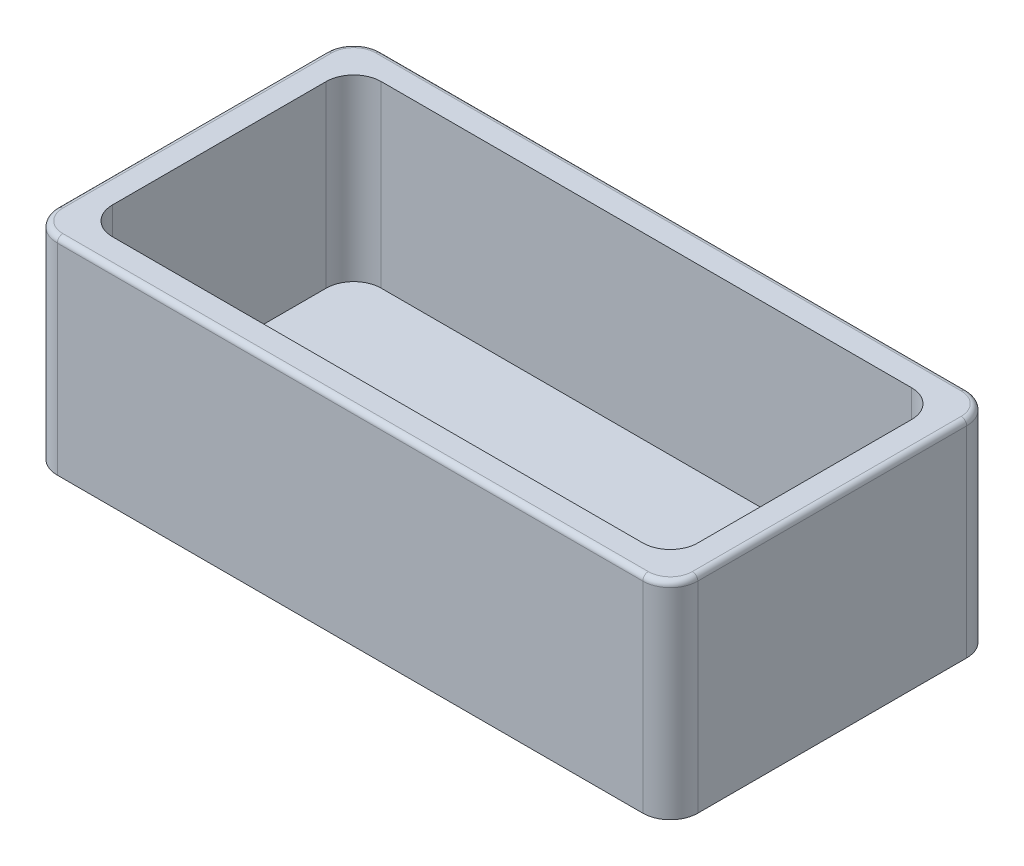
ISO-10303-21;
HEADER;
FILE_DESCRIPTION(('STEP AP214'),'2;1');
FILE_NAME('part.step','',(''),(''),'','','');
FILE_SCHEMA(('AUTOMOTIVE_DESIGN { 1 0 10303 214 1 1 1 1 }'));
ENDSEC;
DATA;
#1=APPLICATION_CONTEXT('core data for automotive mechanical design processes');
#2=APPLICATION_PROTOCOL_DEFINITION('international standard','automotive_design',2000,#1);
#3=PRODUCT_CONTEXT('',#1,'mechanical');
#4=PRODUCT('Part','Part','',(#3));
#5=PRODUCT_RELATED_PRODUCT_CATEGORY('part','',(#4));
#6=PRODUCT_DEFINITION_FORMATION('','',#4);
#7=PRODUCT_DEFINITION_CONTEXT('part definition',#1,'design');
#8=PRODUCT_DEFINITION('design','',#6,#7);
#9=PRODUCT_DEFINITION_SHAPE('','',#8);
#10=(LENGTH_UNIT() NAMED_UNIT(*) SI_UNIT(.MILLI.,.METRE.));
#11=(NAMED_UNIT(*) PLANE_ANGLE_UNIT() SI_UNIT($,.RADIAN.));
#12=(NAMED_UNIT(*) SI_UNIT($,.STERADIAN.) SOLID_ANGLE_UNIT());
#13=UNCERTAINTY_MEASURE_WITH_UNIT(LENGTH_MEASURE(1.E-05),#10,'distance_accuracy_value','');
#14=(GEOMETRIC_REPRESENTATION_CONTEXT(3) GLOBAL_UNCERTAINTY_ASSIGNED_CONTEXT((#13)) GLOBAL_UNIT_ASSIGNED_CONTEXT((#10,
#11,#12)) REPRESENTATION_CONTEXT('',''));
#15=CARTESIAN_POINT('',(0.,0.,0.));
#16=DIRECTION('',(0.,0.,1.));
#17=DIRECTION('',(1.,0.,0.));
#18=AXIS2_PLACEMENT_3D('',#15,#16,#17);
#19=CARTESIAN_POINT('',(0.,75.,0.));
#20=DIRECTION('',(0.,1.,0.));
#21=DIRECTION('',(0.,0.,1.));
#22=AXIS2_PLACEMENT_3D('',#19,#20,#21);
#23=PLANE('',#22);
#24=DIRECTION('',(0.,0.,1.));
#25=VECTOR('',#24,1.);
#26=CARTESIAN_POINT('',(-106.600634240789,75.,-55.8103102764005));
#27=LINE('',#26,#25);
#28=CARTESIAN_POINT('',(-106.600634240789,75.,-35.8103102764005));
#29=VERTEX_POINT('',#28);
#30=CARTESIAN_POINT('',(-106.600634240789,75.,41.8132162322969));
#31=VERTEX_POINT('',#30);
#32=EDGE_CURVE('E412',#29,#31,#27,.T.);
#33=ORIENTED_EDGE('',*,*,#32,.F.);
#34=CARTESIAN_POINT('',(-96.6006342407889,75.,-35.8103102764005));
#35=DIRECTION('',(0.,1.,0.));
#36=DIRECTION('',(0.,0.,1.));
#37=AXIS2_PLACEMENT_3D('',#34,#35,#36);
#38=CIRCLE('',#37,10.);
#39=CARTESIAN_POINT('',(-96.6006342407889,75.,-45.8103102764005));
#40=VERTEX_POINT('',#39);
#41=EDGE_CURVE('E253',#29,#40,#38,.F.);
#42=ORIENTED_EDGE('',*,*,#41,.T.);
#43=DIRECTION('',(-1.,0.,0.));
#44=VECTOR('',#43,1.);
#45=CARTESIAN_POINT('',(-116.600634240789,75.,-45.8103102764005));
#46=LINE('',#45,#44);
#47=CARTESIAN_POINT('',(96.0074293998082,75.,-45.8103102764005));
#48=VERTEX_POINT('',#47);
#49=EDGE_CURVE('E401',#48,#40,#46,.T.);
#50=ORIENTED_EDGE('',*,*,#49,.F.);
#51=CARTESIAN_POINT('',(96.0074293998082,75.,-35.8103102764005));
#52=DIRECTION('',(0.,1.,0.));
#53=DIRECTION('',(0.,0.,1.));
#54=AXIS2_PLACEMENT_3D('',#51,#52,#53);
#55=CIRCLE('',#54,10.);
#56=CARTESIAN_POINT('',(106.007429399808,75.,-35.8103102764005));
#57=VERTEX_POINT('',#56);
#58=EDGE_CURVE('E248',#48,#57,#55,.F.);
#59=ORIENTED_EDGE('',*,*,#58,.T.);
#60=DIRECTION('',(0.,0.,-1.));
#61=VECTOR('',#60,1.);
#62=CARTESIAN_POINT('',(106.007429399808,75.,-55.8103102764005));
#63=LINE('',#62,#61);
#64=CARTESIAN_POINT('',(106.007429399808,75.,41.8132162322969));
#65=VERTEX_POINT('',#64);
#66=EDGE_CURVE('E405',#65,#57,#63,.T.);
#67=ORIENTED_EDGE('',*,*,#66,.F.);
#68=CARTESIAN_POINT('',(96.0074293998083,75.,41.8132162322969));
#69=DIRECTION('',(0.,1.,0.));
#70=DIRECTION('',(0.,0.,1.));
#71=AXIS2_PLACEMENT_3D('',#68,#69,#70);
#72=CIRCLE('',#71,10.);
#73=CARTESIAN_POINT('',(96.0074293998083,75.,51.8132162322969));
#74=VERTEX_POINT('',#73);
#75=EDGE_CURVE('E209',#65,#74,#72,.F.);
#76=ORIENTED_EDGE('',*,*,#75,.T.);
#77=DIRECTION('',(1.,0.,0.));
#78=VECTOR('',#77,1.);
#79=CARTESIAN_POINT('',(-116.600634240789,75.,51.8132162322969));
#80=LINE('',#79,#78);
#81=CARTESIAN_POINT('',(-96.6006342407889,75.,51.8132162322969));
#82=VERTEX_POINT('',#81);
#83=EDGE_CURVE('E408',#82,#74,#80,.T.);
#84=ORIENTED_EDGE('',*,*,#83,.F.);
#85=CARTESIAN_POINT('',(-96.6006342407889,75.,41.8132162322969));
#86=DIRECTION('',(0.,1.,0.));
#87=DIRECTION('',(0.,0.,1.));
#88=AXIS2_PLACEMENT_3D('',#85,#86,#87);
#89=CIRCLE('',#88,10.);
#90=EDGE_CURVE('E256',#82,#31,#89,.F.);
#91=ORIENTED_EDGE('',*,*,#90,.T.);
#92=EDGE_LOOP('',(#33,#42,#50,#59,#67,#76,#84,#91));
#93=FACE_BOUND('',#92,.T.);
#94=CARTESIAN_POINT('',(106.007429399808,75.,-45.8103102764005));
#95=DIRECTION('',(0.,1.,0.));
#96=DIRECTION('',(0.,0.,1.));
#97=AXIS2_PLACEMENT_3D('',#94,#95,#96);
#98=CIRCLE('',#97,8.);
#99=CARTESIAN_POINT('',(106.007429399808,75.,-53.8103102764005));
#100=VERTEX_POINT('',#99);
#101=CARTESIAN_POINT('',(114.007429399808,75.,-45.8103102764005));
#102=VERTEX_POINT('',#101);
#103=EDGE_CURVE('E308',#100,#102,#98,.F.);
#104=ORIENTED_EDGE('',*,*,#103,.F.);
#105=DIRECTION('',(-1.,0.,0.));
#106=VECTOR('',#105,1.);
#107=CARTESIAN_POINT('',(-116.600634240789,75.,-53.8103102764005));
#108=LINE('',#107,#106);
#109=CARTESIAN_POINT('',(-106.600634240789,75.,-53.8103102764005));
#110=VERTEX_POINT('',#109);
#111=EDGE_CURVE('E271',#100,#110,#108,.T.);
#112=ORIENTED_EDGE('',*,*,#111,.T.);
#113=CARTESIAN_POINT('',(-106.600634240789,75.,-45.8103102764005));
#114=DIRECTION('',(0.,1.,0.));
#115=DIRECTION('',(0.,0.,1.));
#116=AXIS2_PLACEMENT_3D('',#113,#114,#115);
#117=CIRCLE('',#116,8.);
#118=CARTESIAN_POINT('',(-114.600634240789,75.,-45.8103102764005));
#119=VERTEX_POINT('',#118);
#120=EDGE_CURVE('E304',#119,#110,#117,.F.);
#121=ORIENTED_EDGE('',*,*,#120,.F.);
#122=DIRECTION('',(0.,0.,1.));
#123=VECTOR('',#122,1.);
#124=CARTESIAN_POINT('',(-114.600634240789,75.,61.8132162322969));
#125=LINE('',#124,#123);
#126=CARTESIAN_POINT('',(-114.600634240789,75.,51.8132162322969));
#127=VERTEX_POINT('',#126);
#128=EDGE_CURVE('E267',#119,#127,#125,.T.);
#129=ORIENTED_EDGE('',*,*,#128,.T.);
#130=CARTESIAN_POINT('',(-106.600634240789,75.,51.8132162322969));
#131=DIRECTION('',(0.,1.,0.));
#132=DIRECTION('',(0.,0.,1.));
#133=AXIS2_PLACEMENT_3D('',#130,#131,#132);
#134=CIRCLE('',#133,8.);
#135=CARTESIAN_POINT('',(-106.600634240789,75.,59.8132162322969));
#136=VERTEX_POINT('',#135);
#137=EDGE_CURVE('E300',#136,#127,#134,.F.);
#138=ORIENTED_EDGE('',*,*,#137,.F.);
#139=DIRECTION('',(1.,0.,0.));
#140=VECTOR('',#139,1.);
#141=CARTESIAN_POINT('',(116.007429399808,75.,59.8132162322969));
#142=LINE('',#141,#140);
#143=CARTESIAN_POINT('',(106.007429399808,75.,59.8132162322969));
#144=VERTEX_POINT('',#143);
#145=EDGE_CURVE('E263',#136,#144,#142,.T.);
#146=ORIENTED_EDGE('',*,*,#145,.T.);
#147=CARTESIAN_POINT('',(106.007429399808,75.,51.8132162322969));
#148=DIRECTION('',(0.,1.,0.));
#149=DIRECTION('',(0.,0.,1.));
#150=AXIS2_PLACEMENT_3D('',#147,#148,#149);
#151=CIRCLE('',#150,8.);
#152=CARTESIAN_POINT('',(114.007429399808,75.,51.8132162322969));
#153=VERTEX_POINT('',#152);
#154=EDGE_CURVE('E297',#153,#144,#151,.F.);
#155=ORIENTED_EDGE('',*,*,#154,.F.);
#156=DIRECTION('',(0.,0.,-1.));
#157=VECTOR('',#156,1.);
#158=CARTESIAN_POINT('',(114.007429399808,75.,-55.8103102764005));
#159=LINE('',#158,#157);
#160=EDGE_CURVE('E259',#153,#102,#159,.T.);
#161=ORIENTED_EDGE('',*,*,#160,.T.);
#162=EDGE_LOOP('',(#104,#112,#121,#129,#138,#146,#155,#161));
#163=FACE_BOUND('',#162,.T.);
#164=ADVANCED_FACE('F41',(#93,#163),#23,.T.);
#165=CARTESIAN_POINT('',(-116.600634240789,75.,-55.8103102764005));
#166=DIRECTION('',(1.,0.,0.));
#167=DIRECTION('',(0.,0.,-1.));
#168=AXIS2_PLACEMENT_3D('',#165,#166,#167);
#169=PLANE('',#168);
#170=DIRECTION('',(0.,0.,1.));
#171=VECTOR('',#170,1.);
#172=CARTESIAN_POINT('',(-116.600634240789,0.,-55.8103102764005));
#173=LINE('',#172,#171);
#174=CARTESIAN_POINT('',(-116.600634240789,0.,-45.8103102764005));
#175=VERTEX_POINT('',#174);
#176=CARTESIAN_POINT('',(-116.600634240789,0.,51.8132162322969));
#177=VERTEX_POINT('',#176);
#178=EDGE_CURVE('E395',#175,#177,#173,.T.);
#179=ORIENTED_EDGE('',*,*,#178,.T.);
#180=DIRECTION('',(0.,-1.,0.));
#181=VECTOR('',#180,1.);
#182=CARTESIAN_POINT('',(-116.600634240789,75.,51.8132162322969));
#183=LINE('',#182,#181);
#184=CARTESIAN_POINT('',(-116.600634240789,73.,51.8132162322969));
#185=VERTEX_POINT('',#184);
#186=EDGE_CURVE('E355',#177,#185,#183,.F.);
#187=ORIENTED_EDGE('',*,*,#186,.T.);
#188=DIRECTION('',(0.,0.,1.));
#189=VECTOR('',#188,1.);
#190=CARTESIAN_POINT('',(-116.600634240789,73.,-55.8103102764005));
#191=LINE('',#190,#189);
#192=CARTESIAN_POINT('',(-116.600634240789,73.,-45.8103102764005));
#193=VERTEX_POINT('',#192);
#194=EDGE_CURVE('E279',#185,#193,#191,.F.);
#195=ORIENTED_EDGE('',*,*,#194,.T.);
#196=DIRECTION('',(0.,-1.,0.));
#197=VECTOR('',#196,1.);
#198=CARTESIAN_POINT('',(-116.600634240789,75.,-45.8103102764005));
#199=LINE('',#198,#197);
#200=EDGE_CURVE('E352',#193,#175,#199,.T.);
#201=ORIENTED_EDGE('',*,*,#200,.T.);
#202=EDGE_LOOP('',(#179,#187,#195,#201));
#203=FACE_BOUND('',#202,.T.);
#204=ADVANCED_FACE('F463',(#203),#169,.F.);
#205=CARTESIAN_POINT('',(-116.600634240789,75.,61.8132162322969));
#206=DIRECTION('',(0.,0.,-1.));
#207=DIRECTION('',(-1.,0.,0.));
#208=AXIS2_PLACEMENT_3D('',#205,#206,#207);
#209=PLANE('',#208);
#210=DIRECTION('',(1.,0.,0.));
#211=VECTOR('',#210,1.);
#212=CARTESIAN_POINT('',(-116.600634240789,0.,61.8132162322969));
#213=LINE('',#212,#211);
#214=CARTESIAN_POINT('',(-106.600634240789,0.,61.8132162322969));
#215=VERTEX_POINT('',#214);
#216=CARTESIAN_POINT('',(106.007429399808,0.,61.8132162322969));
#217=VERTEX_POINT('',#216);
#218=EDGE_CURVE('E393',#215,#217,#213,.T.);
#219=ORIENTED_EDGE('',*,*,#218,.T.);
#220=DIRECTION('',(0.,-1.,0.));
#221=VECTOR('',#220,1.);
#222=CARTESIAN_POINT('',(106.007429399808,75.,61.8132162322969));
#223=LINE('',#222,#221);
#224=CARTESIAN_POINT('',(106.007429399808,73.,61.8132162322969));
#225=VERTEX_POINT('',#224);
#226=EDGE_CURVE('E349',#217,#225,#223,.F.);
#227=ORIENTED_EDGE('',*,*,#226,.T.);
#228=DIRECTION('',(1.,0.,0.));
#229=VECTOR('',#228,1.);
#230=CARTESIAN_POINT('',(-116.600634240789,73.,61.8132162322969));
#231=LINE('',#230,#229);
#232=CARTESIAN_POINT('',(-106.600634240789,73.,61.8132162322969));
#233=VERTEX_POINT('',#232);
#234=EDGE_CURVE('E283',#225,#233,#231,.F.);
#235=ORIENTED_EDGE('',*,*,#234,.T.);
#236=DIRECTION('',(0.,-1.,0.));
#237=VECTOR('',#236,1.);
#238=CARTESIAN_POINT('',(-106.600634240789,75.,61.8132162322969));
#239=LINE('',#238,#237);
#240=EDGE_CURVE('E66',#233,#215,#239,.T.);
#241=ORIENTED_EDGE('',*,*,#240,.T.);
#242=EDGE_LOOP('',(#219,#227,#235,#241));
#243=FACE_BOUND('',#242,.T.);
#244=ADVANCED_FACE('F468',(#243),#209,.F.);
#245=CARTESIAN_POINT('',(116.007429399808,75.,-55.8103102764005));
#246=DIRECTION('',(-1.,0.,0.));
#247=DIRECTION('',(0.,0.,1.));
#248=AXIS2_PLACEMENT_3D('',#245,#246,#247);
#249=PLANE('',#248);
#250=DIRECTION('',(0.,0.,-1.));
#251=VECTOR('',#250,1.);
#252=CARTESIAN_POINT('',(116.007429399808,73.,61.8132162322969));
#253=LINE('',#252,#251);
#254=CARTESIAN_POINT('',(116.007429399808,73.,-45.8103102764005));
#255=VERTEX_POINT('',#254);
#256=CARTESIAN_POINT('',(116.007429399808,73.,51.8132162322969));
#257=VERTEX_POINT('',#256);
#258=EDGE_CURVE('E286',#255,#257,#253,.F.);
#259=ORIENTED_EDGE('',*,*,#258,.T.);
#260=DIRECTION('',(0.,-1.,0.));
#261=VECTOR('',#260,1.);
#262=CARTESIAN_POINT('',(116.007429399808,75.,51.8132162322969));
#263=LINE('',#262,#261);
#264=CARTESIAN_POINT('',(116.007429399808,0.,51.8132162322969));
#265=VERTEX_POINT('',#264);
#266=EDGE_CURVE('E333',#257,#265,#263,.T.);
#267=ORIENTED_EDGE('',*,*,#266,.T.);
#268=DIRECTION('',(0.,0.,-1.));
#269=VECTOR('',#268,1.);
#270=CARTESIAN_POINT('',(116.007429399808,0.,-55.8103102764005));
#271=LINE('',#270,#269);
#272=CARTESIAN_POINT('',(116.007429399808,0.,-45.8103102764005));
#273=VERTEX_POINT('',#272);
#274=EDGE_CURVE('E218',#265,#273,#271,.T.);
#275=ORIENTED_EDGE('',*,*,#274,.T.);
#276=DIRECTION('',(0.,-1.,0.));
#277=VECTOR('',#276,1.);
#278=CARTESIAN_POINT('',(116.007429399808,75.,-45.8103102764005));
#279=LINE('',#278,#277);
#280=EDGE_CURVE('E330',#273,#255,#279,.F.);
#281=ORIENTED_EDGE('',*,*,#280,.T.);
#282=EDGE_LOOP('',(#259,#267,#275,#281));
#283=FACE_BOUND('',#282,.T.);
#284=ADVANCED_FACE('F386',(#283),#249,.F.);
#285=CARTESIAN_POINT('',(-116.600634240789,75.,-55.8103102764005));
#286=DIRECTION('',(0.,0.,1.));
#287=DIRECTION('',(1.,0.,0.));
#288=AXIS2_PLACEMENT_3D('',#285,#286,#287);
#289=PLANE('',#288);
#290=DIRECTION('',(-1.,0.,0.));
#291=VECTOR('',#290,1.);
#292=CARTESIAN_POINT('',(-116.600634240789,0.,-55.8103102764005));
#293=LINE('',#292,#291);
#294=CARTESIAN_POINT('',(106.007429399808,0.,-55.8103102764005));
#295=VERTEX_POINT('',#294);
#296=CARTESIAN_POINT('',(-106.600634240789,0.,-55.8103102764005));
#297=VERTEX_POINT('',#296);
#298=EDGE_CURVE('E211',#295,#297,#293,.T.);
#299=ORIENTED_EDGE('',*,*,#298,.T.);
#300=DIRECTION('',(0.,-1.,0.));
#301=VECTOR('',#300,1.);
#302=CARTESIAN_POINT('',(-106.600634240789,75.,-55.8103102764005));
#303=LINE('',#302,#301);
#304=CARTESIAN_POINT('',(-106.600634240789,73.,-55.8103102764005));
#305=VERTEX_POINT('',#304);
#306=EDGE_CURVE('E11',#297,#305,#303,.F.);
#307=ORIENTED_EDGE('',*,*,#306,.T.);
#308=DIRECTION('',(-1.,0.,0.));
#309=VECTOR('',#308,1.);
#310=CARTESIAN_POINT('',(116.007429399808,73.,-55.8103102764005));
#311=LINE('',#310,#309);
#312=CARTESIAN_POINT('',(106.007429399808,73.,-55.8103102764005));
#313=VERTEX_POINT('',#312);
#314=EDGE_CURVE('E275',#305,#313,#311,.F.);
#315=ORIENTED_EDGE('',*,*,#314,.T.);
#316=DIRECTION('',(0.,-1.,0.));
#317=VECTOR('',#316,1.);
#318=CARTESIAN_POINT('',(106.007429399808,75.,-55.8103102764005));
#319=LINE('',#318,#317);
#320=EDGE_CURVE('E51',#313,#295,#319,.T.);
#321=ORIENTED_EDGE('',*,*,#320,.T.);
#322=EDGE_LOOP('',(#299,#307,#315,#321));
#323=FACE_BOUND('',#322,.T.);
#324=ADVANCED_FACE('F476',(#323),#289,.F.);
#325=CARTESIAN_POINT('',(0.,0.,0.));
#326=DIRECTION('',(0.,1.,0.));
#327=DIRECTION('',(0.,0.,1.));
#328=AXIS2_PLACEMENT_3D('',#325,#326,#327);
#329=PLANE('',#328);
#330=ORIENTED_EDGE('',*,*,#274,.F.);
#331=CARTESIAN_POINT('',(106.007429399808,0.,51.8132162322969));
#332=DIRECTION('',(0.,1.,0.));
#333=DIRECTION('',(0.,0.,1.));
#334=AXIS2_PLACEMENT_3D('',#331,#332,#333);
#335=CIRCLE('',#334,10.);
#336=EDGE_CURVE('E59',#265,#217,#335,.F.);
#337=ORIENTED_EDGE('',*,*,#336,.T.);
#338=ORIENTED_EDGE('',*,*,#218,.F.);
#339=CARTESIAN_POINT('',(-106.600634240789,0.,51.8132162322969));
#340=DIRECTION('',(0.,1.,0.));
#341=DIRECTION('',(0.,0.,1.));
#342=AXIS2_PLACEMENT_3D('',#339,#340,#341);
#343=CIRCLE('',#342,10.);
#344=EDGE_CURVE('E342',#215,#177,#343,.F.);
#345=ORIENTED_EDGE('',*,*,#344,.T.);
#346=ORIENTED_EDGE('',*,*,#178,.F.);
#347=CARTESIAN_POINT('',(-106.600634240789,0.,-45.8103102764005));
#348=DIRECTION('',(0.,1.,0.));
#349=DIRECTION('',(0.,0.,1.));
#350=AXIS2_PLACEMENT_3D('',#347,#348,#349);
#351=CIRCLE('',#350,10.);
#352=EDGE_CURVE('E339',#175,#297,#351,.F.);
#353=ORIENTED_EDGE('',*,*,#352,.T.);
#354=ORIENTED_EDGE('',*,*,#298,.F.);
#355=CARTESIAN_POINT('',(106.007429399808,0.,-45.8103102764005));
#356=DIRECTION('',(0.,1.,0.));
#357=DIRECTION('',(0.,0.,1.));
#358=AXIS2_PLACEMENT_3D('',#355,#356,#357);
#359=CIRCLE('',#358,10.);
#360=EDGE_CURVE('E336',#295,#273,#359,.F.);
#361=ORIENTED_EDGE('',*,*,#360,.T.);
#362=EDGE_LOOP('',(#330,#337,#338,#345,#346,#353,#354,#361));
#363=FACE_BOUND('',#362,.T.);
#364=ADVANCED_FACE('F389',(#363),#329,.F.);
#365=CARTESIAN_POINT('',(-106.600634240789,75.,-55.8103102764005));
#366=DIRECTION('',(1.,0.,0.));
#367=DIRECTION('',(0.,0.,-1.));
#368=AXIS2_PLACEMENT_3D('',#365,#366,#367);
#369=PLANE('',#368);
#370=DIRECTION('',(0.,0.,1.));
#371=VECTOR('',#370,1.);
#372=CARTESIAN_POINT('',(-106.600634240789,9.99999999999999,-55.8103102764005));
#373=LINE('',#372,#371);
#374=CARTESIAN_POINT('',(-106.600634240789,9.99999999999999,-35.8103102764005));
#375=VERTEX_POINT('',#374);
#376=CARTESIAN_POINT('',(-106.600634240789,9.99999999999999,41.8132162322969));
#377=VERTEX_POINT('',#376);
#378=EDGE_CURVE('E364',#375,#377,#373,.T.);
#379=ORIENTED_EDGE('',*,*,#378,.F.);
#380=DIRECTION('',(0.,-1.,0.));
#381=VECTOR('',#380,1.);
#382=CARTESIAN_POINT('',(-106.600634240789,75.,-35.8103102764005));
#383=LINE('',#382,#381);
#384=EDGE_CURVE('E245',#375,#29,#383,.F.);
#385=ORIENTED_EDGE('',*,*,#384,.T.);
#386=ORIENTED_EDGE('',*,*,#32,.T.);
#387=DIRECTION('',(0.,-1.,0.));
#388=VECTOR('',#387,1.);
#389=CARTESIAN_POINT('',(-106.600634240789,9.99999999999999,41.8132162322969));
#390=LINE('',#389,#388);
#391=EDGE_CURVE('E241',#31,#377,#390,.T.);
#392=ORIENTED_EDGE('',*,*,#391,.T.);
#393=EDGE_LOOP('',(#379,#385,#386,#392));
#394=FACE_BOUND('',#393,.T.);
#395=ADVANCED_FACE('F426',(#394),#369,.T.);
#396=CARTESIAN_POINT('',(-116.600634240789,75.,51.8132162322969));
#397=DIRECTION('',(0.,0.,-1.));
#398=DIRECTION('',(-1.,0.,0.));
#399=AXIS2_PLACEMENT_3D('',#396,#397,#398);
#400=PLANE('',#399);
#401=ORIENTED_EDGE('',*,*,#83,.T.);
#402=DIRECTION('',(0.,-1.,0.));
#403=VECTOR('',#402,1.);
#404=CARTESIAN_POINT('',(96.0074293998083,9.99999999999999,51.8132162322969));
#405=LINE('',#404,#403);
#406=CARTESIAN_POINT('',(96.0074293998083,9.99999999999999,51.8132162322969));
#407=VERTEX_POINT('',#406);
#408=EDGE_CURVE('E238',#74,#407,#405,.T.);
#409=ORIENTED_EDGE('',*,*,#408,.T.);
#410=DIRECTION('',(1.,0.,0.));
#411=VECTOR('',#410,1.);
#412=CARTESIAN_POINT('',(-116.600634240789,9.99999999999999,51.8132162322969));
#413=LINE('',#412,#411);
#414=CARTESIAN_POINT('',(-96.6006342407889,9.99999999999999,51.8132162322969));
#415=VERTEX_POINT('',#414);
#416=EDGE_CURVE('E187',#415,#407,#413,.T.);
#417=ORIENTED_EDGE('',*,*,#416,.F.);
#418=DIRECTION('',(0.,-1.,0.));
#419=VECTOR('',#418,1.);
#420=CARTESIAN_POINT('',(-96.6006342407889,75.,51.8132162322969));
#421=LINE('',#420,#419);
#422=EDGE_CURVE('E235',#415,#82,#421,.F.);
#423=ORIENTED_EDGE('',*,*,#422,.T.);
#424=EDGE_LOOP('',(#401,#409,#417,#423));
#425=FACE_BOUND('',#424,.T.);
#426=ADVANCED_FACE('F446',(#425),#400,.T.);
#427=CARTESIAN_POINT('',(106.007429399808,75.,-55.8103102764005));
#428=DIRECTION('',(-1.,0.,0.));
#429=DIRECTION('',(0.,0.,1.));
#430=AXIS2_PLACEMENT_3D('',#427,#428,#429);
#431=PLANE('',#430);
#432=ORIENTED_EDGE('',*,*,#66,.T.);
#433=DIRECTION('',(0.,-1.,0.));
#434=VECTOR('',#433,1.);
#435=CARTESIAN_POINT('',(106.007429399808,9.99999999999999,-35.8103102764005));
#436=LINE('',#435,#434);
#437=CARTESIAN_POINT('',(106.007429399808,9.99999999999999,-35.8103102764005));
#438=VERTEX_POINT('',#437);
#439=EDGE_CURVE('E203',#57,#438,#436,.T.);
#440=ORIENTED_EDGE('',*,*,#439,.T.);
#441=DIRECTION('',(0.,0.,-1.));
#442=VECTOR('',#441,1.);
#443=CARTESIAN_POINT('',(106.007429399808,9.99999999999999,-55.8103102764005));
#444=LINE('',#443,#442);
#445=CARTESIAN_POINT('',(106.007429399808,9.99999999999999,41.8132162322969));
#446=VERTEX_POINT('',#445);
#447=EDGE_CURVE('E185',#446,#438,#444,.T.);
#448=ORIENTED_EDGE('',*,*,#447,.F.);
#449=DIRECTION('',(0.,-1.,0.));
#450=VECTOR('',#449,1.);
#451=CARTESIAN_POINT('',(106.007429399808,75.,41.8132162322969));
#452=LINE('',#451,#450);
#453=EDGE_CURVE('E200',#446,#65,#452,.F.);
#454=ORIENTED_EDGE('',*,*,#453,.T.);
#455=EDGE_LOOP('',(#432,#440,#448,#454));
#456=FACE_BOUND('',#455,.T.);
#457=ADVANCED_FACE('F199',(#456),#431,.T.);
#458=CARTESIAN_POINT('',(-116.600634240789,75.,-45.8103102764005));
#459=DIRECTION('',(0.,0.,1.));
#460=DIRECTION('',(1.,0.,0.));
#461=AXIS2_PLACEMENT_3D('',#458,#459,#460);
#462=PLANE('',#461);
#463=DIRECTION('',(-1.,0.,0.));
#464=VECTOR('',#463,1.);
#465=CARTESIAN_POINT('',(-116.600634240789,9.99999999999999,-45.8103102764005));
#466=LINE('',#465,#464);
#467=CARTESIAN_POINT('',(96.0074293998082,9.99999999999999,-45.8103102764005));
#468=VERTEX_POINT('',#467);
#469=CARTESIAN_POINT('',(-96.6006342407889,9.99999999999999,-45.8103102764005));
#470=VERTEX_POINT('',#469);
#471=EDGE_CURVE('E205',#468,#470,#466,.T.);
#472=ORIENTED_EDGE('',*,*,#471,.F.);
#473=DIRECTION('',(0.,-1.,0.));
#474=VECTOR('',#473,1.);
#475=CARTESIAN_POINT('',(96.0074293998082,75.,-45.8103102764005));
#476=LINE('',#475,#474);
#477=EDGE_CURVE('E232',#468,#48,#476,.F.);
#478=ORIENTED_EDGE('',*,*,#477,.T.);
#479=ORIENTED_EDGE('',*,*,#49,.T.);
#480=DIRECTION('',(0.,-1.,0.));
#481=VECTOR('',#480,1.);
#482=CARTESIAN_POINT('',(-96.6006342407889,9.99999999999999,-45.8103102764005));
#483=LINE('',#482,#481);
#484=EDGE_CURVE('E228',#40,#470,#483,.T.);
#485=ORIENTED_EDGE('',*,*,#484,.T.);
#486=EDGE_LOOP('',(#472,#478,#479,#485));
#487=FACE_BOUND('',#486,.T.);
#488=ADVANCED_FACE('F439',(#487),#462,.T.);
#489=CARTESIAN_POINT('',(0.,10.,0.));
#490=DIRECTION('',(0.,1.,0.));
#491=DIRECTION('',(0.,0.,1.));
#492=AXIS2_PLACEMENT_3D('',#489,#490,#491);
#493=PLANE('',#492);
#494=ORIENTED_EDGE('',*,*,#447,.T.);
#495=CARTESIAN_POINT('',(96.0074293998082,9.99999999999999,-35.8103102764005));
#496=DIRECTION('',(0.,1.,0.));
#497=DIRECTION('',(0.,0.,1.));
#498=AXIS2_PLACEMENT_3D('',#495,#496,#497);
#499=CIRCLE('',#498,10.);
#500=EDGE_CURVE('E193',#438,#468,#499,.T.);
#501=ORIENTED_EDGE('',*,*,#500,.T.);
#502=ORIENTED_EDGE('',*,*,#471,.T.);
#503=CARTESIAN_POINT('',(-96.6006342407889,9.99999999999999,-35.8103102764005));
#504=DIRECTION('',(0.,1.,0.));
#505=DIRECTION('',(0.,0.,1.));
#506=AXIS2_PLACEMENT_3D('',#503,#504,#505);
#507=CIRCLE('',#506,10.);
#508=EDGE_CURVE('E194',#470,#375,#507,.T.);
#509=ORIENTED_EDGE('',*,*,#508,.T.);
#510=ORIENTED_EDGE('',*,*,#378,.T.);
#511=CARTESIAN_POINT('',(-96.6006342407889,9.99999999999999,41.8132162322969));
#512=DIRECTION('',(0.,1.,0.));
#513=DIRECTION('',(0.,0.,1.));
#514=AXIS2_PLACEMENT_3D('',#511,#512,#513);
#515=CIRCLE('',#514,10.);
#516=EDGE_CURVE('E215',#377,#415,#515,.T.);
#517=ORIENTED_EDGE('',*,*,#516,.T.);
#518=ORIENTED_EDGE('',*,*,#416,.T.);
#519=CARTESIAN_POINT('',(96.0074293998083,9.99999999999999,41.8132162322969));
#520=DIRECTION('',(0.,1.,0.));
#521=DIRECTION('',(0.,0.,1.));
#522=AXIS2_PLACEMENT_3D('',#519,#520,#521);
#523=CIRCLE('',#522,10.);
#524=EDGE_CURVE('E182',#407,#446,#523,.T.);
#525=ORIENTED_EDGE('',*,*,#524,.T.);
#526=EDGE_LOOP('',(#494,#501,#502,#509,#510,#517,#518,#525));
#527=FACE_BOUND('',#526,.T.);
#528=ADVANCED_FACE('F184',(#527),#493,.T.);
#529=CARTESIAN_POINT('',(96.0074293998082,75.,-35.8103102764005));
#530=DIRECTION('',(0.,1.,0.));
#531=DIRECTION('',(0.,0.,1.));
#532=AXIS2_PLACEMENT_3D('',#529,#530,#531);
#533=CYLINDRICAL_SURFACE('',#532,10.);
#534=ORIENTED_EDGE('',*,*,#58,.F.);
#535=ORIENTED_EDGE('',*,*,#477,.F.);
#536=ORIENTED_EDGE('',*,*,#500,.F.);
#537=ORIENTED_EDGE('',*,*,#439,.F.);
#538=EDGE_LOOP('',(#534,#535,#536,#537));
#539=FACE_BOUND('',#538,.T.);
#540=ADVANCED_FACE('F442',(#539),#533,.F.);
#541=CARTESIAN_POINT('',(96.0074293998083,75.,41.8132162322969));
#542=DIRECTION('',(0.,1.,0.));
#543=DIRECTION('',(0.,0.,1.));
#544=AXIS2_PLACEMENT_3D('',#541,#542,#543);
#545=CYLINDRICAL_SURFACE('',#544,10.);
#546=ORIENTED_EDGE('',*,*,#75,.F.);
#547=ORIENTED_EDGE('',*,*,#453,.F.);
#548=ORIENTED_EDGE('',*,*,#524,.F.);
#549=ORIENTED_EDGE('',*,*,#408,.F.);
#550=EDGE_LOOP('',(#546,#547,#548,#549));
#551=FACE_BOUND('',#550,.T.);
#552=ADVANCED_FACE('F208',(#551),#545,.F.);
#553=CARTESIAN_POINT('',(-96.6006342407889,75.,-35.8103102764005));
#554=DIRECTION('',(0.,1.,0.));
#555=DIRECTION('',(0.,0.,1.));
#556=AXIS2_PLACEMENT_3D('',#553,#554,#555);
#557=CYLINDRICAL_SURFACE('',#556,10.);
#558=ORIENTED_EDGE('',*,*,#41,.F.);
#559=ORIENTED_EDGE('',*,*,#384,.F.);
#560=ORIENTED_EDGE('',*,*,#508,.F.);
#561=ORIENTED_EDGE('',*,*,#484,.F.);
#562=EDGE_LOOP('',(#558,#559,#560,#561));
#563=FACE_BOUND('',#562,.T.);
#564=ADVANCED_FACE('F431',(#563),#557,.F.);
#565=CARTESIAN_POINT('',(-96.6006342407889,75.,41.8132162322969));
#566=DIRECTION('',(0.,1.,0.));
#567=DIRECTION('',(0.,0.,1.));
#568=AXIS2_PLACEMENT_3D('',#565,#566,#567);
#569=CYLINDRICAL_SURFACE('',#568,10.);
#570=ORIENTED_EDGE('',*,*,#90,.F.);
#571=ORIENTED_EDGE('',*,*,#422,.F.);
#572=ORIENTED_EDGE('',*,*,#516,.F.);
#573=ORIENTED_EDGE('',*,*,#391,.F.);
#574=EDGE_LOOP('',(#570,#571,#572,#573));
#575=FACE_BOUND('',#574,.T.);
#576=ADVANCED_FACE('F449',(#575),#569,.F.);
#577=CARTESIAN_POINT('',(0.,73.,59.8132162322969));
#578=DIRECTION('',(-1.,0.,0.));
#579=DIRECTION('',(0.,0.,1.));
#580=AXIS2_PLACEMENT_3D('',#577,#578,#579);
#581=CYLINDRICAL_SURFACE('',#580,2.);
#582=ORIENTED_EDGE('',*,*,#234,.F.);
#583=CARTESIAN_POINT('',(106.007429399808,73.,59.8132162322969));
#584=DIRECTION('',(-1.,0.,0.));
#585=DIRECTION('',(0.,0.,1.));
#586=AXIS2_PLACEMENT_3D('',#583,#584,#585);
#587=CIRCLE('',#586,2.);
#588=EDGE_CURVE('E326',#225,#144,#587,.T.);
#589=ORIENTED_EDGE('',*,*,#588,.T.);
#590=ORIENTED_EDGE('',*,*,#145,.F.);
#591=CARTESIAN_POINT('',(-106.600634240789,73.,59.8132162322969));
#592=DIRECTION('',(1.,0.,0.));
#593=DIRECTION('',(0.,0.,-1.));
#594=AXIS2_PLACEMENT_3D('',#591,#592,#593);
#595=CIRCLE('',#594,2.);
#596=EDGE_CURVE('E323',#136,#233,#595,.T.);
#597=ORIENTED_EDGE('',*,*,#596,.T.);
#598=EDGE_LOOP('',(#582,#589,#590,#597));
#599=FACE_BOUND('',#598,.T.);
#600=ADVANCED_FACE('F451',(#599),#581,.T.);
#601=CARTESIAN_POINT('',(114.007429399808,73.,0.));
#602=DIRECTION('',(0.,0.,1.));
#603=DIRECTION('',(1.,0.,0.));
#604=AXIS2_PLACEMENT_3D('',#601,#602,#603);
#605=CYLINDRICAL_SURFACE('',#604,2.);
#606=ORIENTED_EDGE('',*,*,#258,.F.);
#607=CARTESIAN_POINT('',(114.007429399808,73.,-45.8103102764005));
#608=DIRECTION('',(0.,0.,1.));
#609=DIRECTION('',(1.,0.,0.));
#610=AXIS2_PLACEMENT_3D('',#607,#608,#609);
#611=CIRCLE('',#610,2.);
#612=EDGE_CURVE('E293',#255,#102,#611,.T.);
#613=ORIENTED_EDGE('',*,*,#612,.T.);
#614=ORIENTED_EDGE('',*,*,#160,.F.);
#615=CARTESIAN_POINT('',(114.007429399808,73.,51.8132162322969));
#616=DIRECTION('',(0.,0.,-1.));
#617=DIRECTION('',(-1.,0.,0.));
#618=AXIS2_PLACEMENT_3D('',#615,#616,#617);
#619=CIRCLE('',#618,2.);
#620=EDGE_CURVE('E290',#153,#257,#619,.T.);
#621=ORIENTED_EDGE('',*,*,#620,.T.);
#622=EDGE_LOOP('',(#606,#613,#614,#621));
#623=FACE_BOUND('',#622,.T.);
#624=ADVANCED_FACE('F457',(#623),#605,.T.);
#625=CARTESIAN_POINT('',(-114.600634240789,73.,0.));
#626=DIRECTION('',(0.,0.,-1.));
#627=DIRECTION('',(-1.,0.,0.));
#628=AXIS2_PLACEMENT_3D('',#625,#626,#627);
#629=CYLINDRICAL_SURFACE('',#628,2.);
#630=ORIENTED_EDGE('',*,*,#194,.F.);
#631=CARTESIAN_POINT('',(-114.600634240789,73.,51.8132162322969));
#632=DIRECTION('',(0.,0.,-1.));
#633=DIRECTION('',(-1.,0.,0.));
#634=AXIS2_PLACEMENT_3D('',#631,#632,#633);
#635=CIRCLE('',#634,2.);
#636=EDGE_CURVE('E320',#185,#127,#635,.T.);
#637=ORIENTED_EDGE('',*,*,#636,.T.);
#638=ORIENTED_EDGE('',*,*,#128,.F.);
#639=CARTESIAN_POINT('',(-114.600634240789,73.,-45.8103102764005));
#640=DIRECTION('',(0.,0.,1.));
#641=DIRECTION('',(1.,0.,0.));
#642=AXIS2_PLACEMENT_3D('',#639,#640,#641);
#643=CIRCLE('',#642,2.);
#644=EDGE_CURVE('E317',#119,#193,#643,.T.);
#645=ORIENTED_EDGE('',*,*,#644,.T.);
#646=EDGE_LOOP('',(#630,#637,#638,#645));
#647=FACE_BOUND('',#646,.T.);
#648=ADVANCED_FACE('F553',(#647),#629,.T.);
#649=CARTESIAN_POINT('',(0.,73.,-53.8103102764005));
#650=DIRECTION('',(1.,0.,0.));
#651=DIRECTION('',(0.,0.,-1.));
#652=AXIS2_PLACEMENT_3D('',#649,#650,#651);
#653=CYLINDRICAL_SURFACE('',#652,2.);
#654=ORIENTED_EDGE('',*,*,#314,.F.);
#655=CARTESIAN_POINT('',(-106.600634240789,73.,-53.8103102764005));
#656=DIRECTION('',(1.,0.,0.));
#657=DIRECTION('',(0.,0.,-1.));
#658=AXIS2_PLACEMENT_3D('',#655,#656,#657);
#659=CIRCLE('',#658,2.);
#660=EDGE_CURVE('E314',#305,#110,#659,.T.);
#661=ORIENTED_EDGE('',*,*,#660,.T.);
#662=ORIENTED_EDGE('',*,*,#111,.F.);
#663=CARTESIAN_POINT('',(106.007429399808,73.,-53.8103102764005));
#664=DIRECTION('',(-1.,0.,0.));
#665=DIRECTION('',(0.,0.,1.));
#666=AXIS2_PLACEMENT_3D('',#663,#664,#665);
#667=CIRCLE('',#666,2.);
#668=EDGE_CURVE('E311',#100,#313,#667,.T.);
#669=ORIENTED_EDGE('',*,*,#668,.T.);
#670=EDGE_LOOP('',(#654,#661,#662,#669));
#671=FACE_BOUND('',#670,.T.);
#672=ADVANCED_FACE('F563',(#671),#653,.T.);
#673=CARTESIAN_POINT('',(106.007429399808,75.,-45.8103102764005));
#674=DIRECTION('',(0.,-1.,0.));
#675=DIRECTION('',(0.,0.,-1.));
#676=AXIS2_PLACEMENT_3D('',#673,#674,#675);
#677=CYLINDRICAL_SURFACE('',#676,10.);
#678=ORIENTED_EDGE('',*,*,#360,.F.);
#679=ORIENTED_EDGE('',*,*,#320,.F.);
#680=CARTESIAN_POINT('',(106.007429399808,73.,-45.8103102764005));
#681=DIRECTION('',(0.,1.,0.));
#682=DIRECTION('',(0.,0.,1.));
#683=AXIS2_PLACEMENT_3D('',#680,#681,#682);
#684=CIRCLE('',#683,10.);
#685=EDGE_CURVE('E360',#255,#313,#684,.T.);
#686=ORIENTED_EDGE('',*,*,#685,.F.);
#687=ORIENTED_EDGE('',*,*,#280,.F.);
#688=EDGE_LOOP('',(#678,#679,#686,#687));
#689=FACE_BOUND('',#688,.T.);
#690=ADVANCED_FACE('F572',(#689),#677,.T.);
#691=CARTESIAN_POINT('',(106.007429399808,73.,-45.8103102764005));
#692=DIRECTION('',(0.,1.,0.));
#693=DIRECTION('',(0.,0.,1.));
#694=AXIS2_PLACEMENT_3D('',#691,#692,#693);
#695=TOROIDAL_SURFACE('',#694,8.,2.);
#696=ORIENTED_EDGE('',*,*,#612,.F.);
#697=ORIENTED_EDGE('',*,*,#685,.T.);
#698=ORIENTED_EDGE('',*,*,#668,.F.);
#699=ORIENTED_EDGE('',*,*,#103,.T.);
#700=EDGE_LOOP('',(#696,#697,#698,#699));
#701=FACE_BOUND('',#700,.T.);
#702=ADVANCED_FACE('F580',(#701),#695,.T.);
#703=CARTESIAN_POINT('',(-106.600634240789,75.,-45.8103102764005));
#704=DIRECTION('',(0.,-1.,0.));
#705=DIRECTION('',(0.,0.,-1.));
#706=AXIS2_PLACEMENT_3D('',#703,#704,#705);
#707=CYLINDRICAL_SURFACE('',#706,10.);
#708=ORIENTED_EDGE('',*,*,#352,.F.);
#709=ORIENTED_EDGE('',*,*,#200,.F.);
#710=CARTESIAN_POINT('',(-106.600634240789,73.,-45.8103102764005));
#711=DIRECTION('',(0.,1.,0.));
#712=DIRECTION('',(0.,0.,1.));
#713=AXIS2_PLACEMENT_3D('',#710,#711,#712);
#714=CIRCLE('',#713,10.);
#715=EDGE_CURVE('E365',#305,#193,#714,.T.);
#716=ORIENTED_EDGE('',*,*,#715,.F.);
#717=ORIENTED_EDGE('',*,*,#306,.F.);
#718=EDGE_LOOP('',(#708,#709,#716,#717));
#719=FACE_BOUND('',#718,.T.);
#720=ADVANCED_FACE('F590',(#719),#707,.T.);
#721=CARTESIAN_POINT('',(-106.600634240789,73.,-45.8103102764005));
#722=DIRECTION('',(0.,1.,0.));
#723=DIRECTION('',(0.,0.,1.));
#724=AXIS2_PLACEMENT_3D('',#721,#722,#723);
#725=TOROIDAL_SURFACE('',#724,8.,2.);
#726=ORIENTED_EDGE('',*,*,#644,.F.);
#727=ORIENTED_EDGE('',*,*,#120,.T.);
#728=ORIENTED_EDGE('',*,*,#660,.F.);
#729=ORIENTED_EDGE('',*,*,#715,.T.);
#730=EDGE_LOOP('',(#726,#727,#728,#729));
#731=FACE_BOUND('',#730,.T.);
#732=ADVANCED_FACE('F601',(#731),#725,.T.);
#733=CARTESIAN_POINT('',(-106.600634240789,75.,51.8132162322969));
#734=DIRECTION('',(0.,-1.,0.));
#735=DIRECTION('',(0.,0.,-1.));
#736=AXIS2_PLACEMENT_3D('',#733,#734,#735);
#737=CYLINDRICAL_SURFACE('',#736,10.);
#738=ORIENTED_EDGE('',*,*,#344,.F.);
#739=ORIENTED_EDGE('',*,*,#240,.F.);
#740=CARTESIAN_POINT('',(-106.600634240789,73.,51.8132162322969));
#741=DIRECTION('',(0.,1.,0.));
#742=DIRECTION('',(0.,0.,1.));
#743=AXIS2_PLACEMENT_3D('',#740,#741,#742);
#744=CIRCLE('',#743,10.);
#745=EDGE_CURVE('E368',#185,#233,#744,.T.);
#746=ORIENTED_EDGE('',*,*,#745,.F.);
#747=ORIENTED_EDGE('',*,*,#186,.F.);
#748=EDGE_LOOP('',(#738,#739,#746,#747));
#749=FACE_BOUND('',#748,.T.);
#750=ADVANCED_FACE('F611',(#749),#737,.T.);
#751=CARTESIAN_POINT('',(-106.600634240789,73.,51.8132162322969));
#752=DIRECTION('',(0.,1.,0.));
#753=DIRECTION('',(0.,0.,1.));
#754=AXIS2_PLACEMENT_3D('',#751,#752,#753);
#755=TOROIDAL_SURFACE('',#754,8.,2.);
#756=ORIENTED_EDGE('',*,*,#596,.F.);
#757=ORIENTED_EDGE('',*,*,#137,.T.);
#758=ORIENTED_EDGE('',*,*,#636,.F.);
#759=ORIENTED_EDGE('',*,*,#745,.T.);
#760=EDGE_LOOP('',(#756,#757,#758,#759));
#761=FACE_BOUND('',#760,.T.);
#762=ADVANCED_FACE('F622',(#761),#755,.T.);
#763=CARTESIAN_POINT('',(106.007429399808,75.,51.8132162322969));
#764=DIRECTION('',(0.,-1.,0.));
#765=DIRECTION('',(0.,0.,-1.));
#766=AXIS2_PLACEMENT_3D('',#763,#764,#765);
#767=CYLINDRICAL_SURFACE('',#766,10.);
#768=ORIENTED_EDGE('',*,*,#336,.F.);
#769=ORIENTED_EDGE('',*,*,#266,.F.);
#770=CARTESIAN_POINT('',(106.007429399808,73.,51.8132162322969));
#771=DIRECTION('',(0.,1.,0.));
#772=DIRECTION('',(0.,0.,1.));
#773=AXIS2_PLACEMENT_3D('',#770,#771,#772);
#774=CIRCLE('',#773,10.);
#775=EDGE_CURVE('E45',#225,#257,#774,.T.);
#776=ORIENTED_EDGE('',*,*,#775,.F.);
#777=ORIENTED_EDGE('',*,*,#226,.F.);
#778=EDGE_LOOP('',(#768,#769,#776,#777));
#779=FACE_BOUND('',#778,.T.);
#780=ADVANCED_FACE('F43',(#779),#767,.T.);
#781=CARTESIAN_POINT('',(106.007429399808,73.,51.8132162322969));
#782=DIRECTION('',(0.,1.,0.));
#783=DIRECTION('',(0.,0.,1.));
#784=AXIS2_PLACEMENT_3D('',#781,#782,#783);
#785=TOROIDAL_SURFACE('',#784,8.,2.);
#786=ORIENTED_EDGE('',*,*,#588,.F.);
#787=ORIENTED_EDGE('',*,*,#775,.T.);
#788=ORIENTED_EDGE('',*,*,#620,.F.);
#789=ORIENTED_EDGE('',*,*,#154,.T.);
#790=EDGE_LOOP('',(#786,#787,#788,#789));
#791=FACE_BOUND('',#790,.T.);
#792=ADVANCED_FACE('F380',(#791),#785,.T.);
#793=CLOSED_SHELL('',(#164,#204,#244,#284,#324,#364,#395,#426,#457,#488,#528,#540,#552,#564,
#576,#600,#624,#648,#672,#690,#702,#720,#732,#750,#762,#780,#792));
#794=MANIFOLD_SOLID_BREP('B2',#793);
#795=ADVANCED_BREP_SHAPE_REPRESENTATION('',(#18,#794),#14);
#796=SHAPE_DEFINITION_REPRESENTATION(#9,#795);
ENDSEC;
END-ISO-10303-21;
